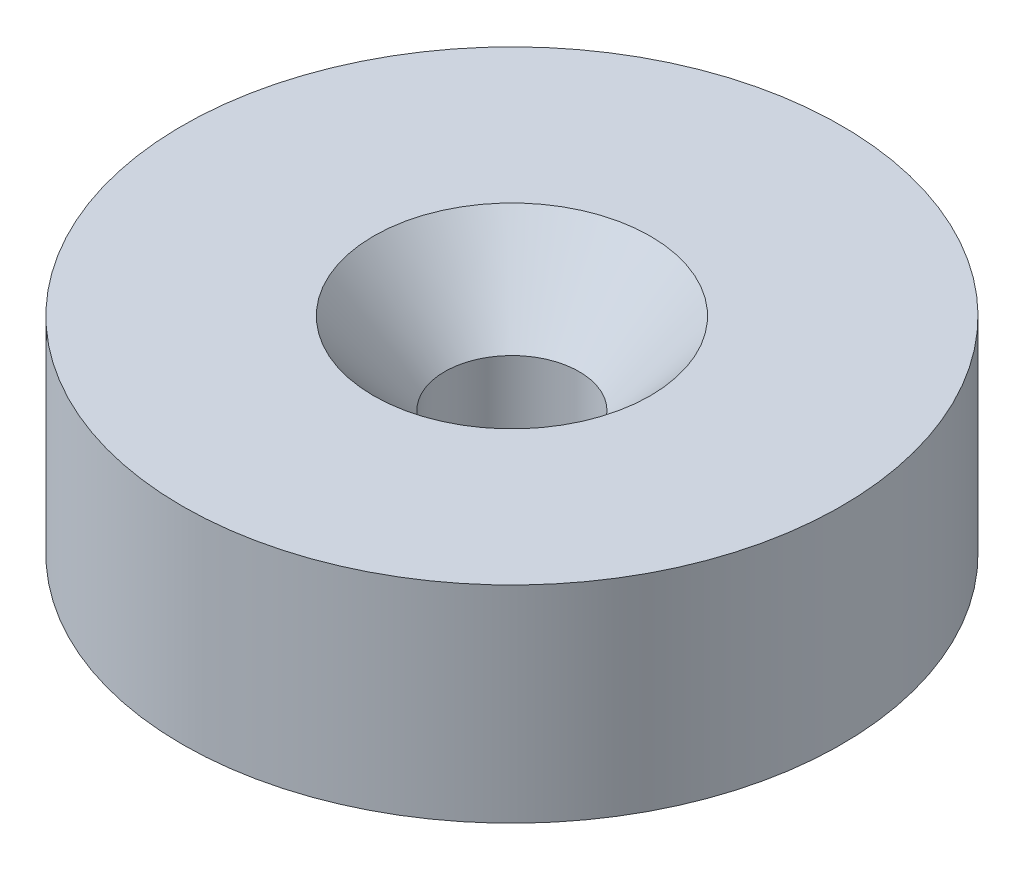
ISO-10303-21;
HEADER;
FILE_DESCRIPTION(('STEP AP214'),'2;1');
FILE_NAME('part.step','',(''),(''),'','','');
FILE_SCHEMA(('AUTOMOTIVE_DESIGN { 1 0 10303 214 1 1 1 1 }'));
ENDSEC;
DATA;
#1=APPLICATION_CONTEXT('core data for automotive mechanical design processes');
#2=APPLICATION_PROTOCOL_DEFINITION('international standard','automotive_design',2000,#1);
#3=PRODUCT_CONTEXT('',#1,'mechanical');
#4=PRODUCT('Part','Part','',(#3));
#5=PRODUCT_RELATED_PRODUCT_CATEGORY('part','',(#4));
#6=PRODUCT_DEFINITION_FORMATION('','',#4);
#7=PRODUCT_DEFINITION_CONTEXT('part definition',#1,'design');
#8=PRODUCT_DEFINITION('design','',#6,#7);
#9=PRODUCT_DEFINITION_SHAPE('','',#8);
#10=(LENGTH_UNIT() NAMED_UNIT(*) SI_UNIT(.MILLI.,.METRE.));
#11=(NAMED_UNIT(*) PLANE_ANGLE_UNIT() SI_UNIT($,.RADIAN.));
#12=(NAMED_UNIT(*) SI_UNIT($,.STERADIAN.) SOLID_ANGLE_UNIT());
#13=UNCERTAINTY_MEASURE_WITH_UNIT(LENGTH_MEASURE(1.E-05),#10,'distance_accuracy_value','');
#14=(GEOMETRIC_REPRESENTATION_CONTEXT(3) GLOBAL_UNCERTAINTY_ASSIGNED_CONTEXT((#13)) GLOBAL_UNIT_ASSIGNED_CONTEXT((#10,
#11,#12)) REPRESENTATION_CONTEXT('',''));
#15=CARTESIAN_POINT('',(0.,0.,0.));
#16=DIRECTION('',(0.,0.,1.));
#17=DIRECTION('',(1.,0.,0.));
#18=AXIS2_PLACEMENT_3D('',#15,#16,#17);
#19=CARTESIAN_POINT('',(0.,7.9502,0.));
#20=DIRECTION('',(0.,-1.,0.));
#21=DIRECTION('',(0.,0.,-1.));
#22=AXIS2_PLACEMENT_3D('',#19,#20,#21);
#23=CYLINDRICAL_SURFACE('',#22,12.7);
#24=CARTESIAN_POINT('',(0.,7.9502,0.));
#25=DIRECTION('',(0.,1.,0.));
#26=DIRECTION('',(0.,0.,1.));
#27=AXIS2_PLACEMENT_3D('',#24,#25,#26);
#28=CIRCLE('',#27,12.7);
#29=CARTESIAN_POINT('',(0.,7.9502,12.7));
#30=VERTEX_POINT('',#29);
#31=EDGE_CURVE('E11',#30,#30,#28,.T.);
#32=ORIENTED_EDGE('',*,*,#31,.F.);
#33=EDGE_LOOP('',(#32));
#34=FACE_BOUND('',#33,.T.);
#35=CARTESIAN_POINT('',(0.,0.,0.));
#36=DIRECTION('',(0.,1.,0.));
#37=DIRECTION('',(0.,0.,1.));
#38=AXIS2_PLACEMENT_3D('',#35,#36,#37);
#39=CIRCLE('',#38,12.7);
#40=CARTESIAN_POINT('',(0.,0.,12.7));
#41=VERTEX_POINT('',#40);
#42=EDGE_CURVE('E49',#41,#41,#39,.T.);
#43=ORIENTED_EDGE('',*,*,#42,.T.);
#44=EDGE_LOOP('',(#43));
#45=FACE_BOUND('',#44,.T.);
#46=ADVANCED_FACE('F43',(#34,#45),#23,.T.);
#47=CARTESIAN_POINT('',(0.,7.9502,0.));
#48=DIRECTION('',(0.,1.,0.));
#49=DIRECTION('',(0.,0.,1.));
#50=AXIS2_PLACEMENT_3D('',#47,#48,#49);
#51=PLANE('',#50);
#52=CARTESIAN_POINT('',(0.,7.9502,0.));
#53=DIRECTION('',(0.,1.,0.));
#54=DIRECTION('',(0.,0.,1.));
#55=AXIS2_PLACEMENT_3D('',#52,#53,#54);
#56=CIRCLE('',#55,5.3310917);
#57=CARTESIAN_POINT('',(0.,7.9502,5.3310917));
#58=VERTEX_POINT('',#57);
#59=EDGE_CURVE('E53',#58,#58,#56,.T.);
#60=ORIENTED_EDGE('',*,*,#59,.F.);
#61=EDGE_LOOP('',(#60));
#62=FACE_BOUND('',#61,.T.);
#63=ORIENTED_EDGE('',*,*,#31,.T.);
#64=EDGE_LOOP('',(#63));
#65=FACE_BOUND('',#64,.T.);
#66=ADVANCED_FACE('F83',(#62,#65),#51,.T.);
#67=CARTESIAN_POINT('',(0.,0.,0.));
#68=DIRECTION('',(0.,1.,0.));
#69=DIRECTION('',(0.,0.,1.));
#70=AXIS2_PLACEMENT_3D('',#67,#68,#69);
#71=PLANE('',#70);
#72=CARTESIAN_POINT('',(0.,0.,0.));
#73=DIRECTION('',(0.,1.,0.));
#74=DIRECTION('',(0.,0.,1.));
#75=AXIS2_PLACEMENT_3D('',#72,#73,#74);
#76=CIRCLE('',#75,2.5908);
#77=CARTESIAN_POINT('',(0.,0.,2.5908));
#78=VERTEX_POINT('',#77);
#79=EDGE_CURVE('E64',#78,#78,#76,.T.);
#80=ORIENTED_EDGE('',*,*,#79,.T.);
#81=EDGE_LOOP('',(#80));
#82=FACE_BOUND('',#81,.T.);
#83=ORIENTED_EDGE('',*,*,#42,.F.);
#84=EDGE_LOOP('',(#83));
#85=FACE_BOUND('',#84,.T.);
#86=ADVANCED_FACE('F68',(#82,#85),#71,.F.);
#87=CARTESIAN_POINT('',(0.,7.9502,0.));
#88=DIRECTION('',(0.,1.,0.));
#89=DIRECTION('',(0.,0.,1.));
#90=AXIS2_PLACEMENT_3D('',#87,#88,#89);
#91=CONICAL_SURFACE('',#90,5.3310917,0.715584993317675);
#92=CARTESIAN_POINT('',(0.,4.79785500175005,0.));
#93=DIRECTION('',(0.,1.,0.));
#94=DIRECTION('',(0.,0.,1.));
#95=AXIS2_PLACEMENT_3D('',#92,#93,#94);
#96=CIRCLE('',#95,2.5908);
#97=CARTESIAN_POINT('',(0.,4.79785500175005,2.5908));
#98=VERTEX_POINT('',#97);
#99=EDGE_CURVE('E58',#98,#98,#96,.T.);
#100=ORIENTED_EDGE('',*,*,#99,.F.);
#101=EDGE_LOOP('',(#100));
#102=FACE_BOUND('',#101,.T.);
#103=ORIENTED_EDGE('',*,*,#59,.T.);
#104=EDGE_LOOP('',(#103));
#105=FACE_BOUND('',#104,.T.);
#106=ADVANCED_FACE('F74',(#102,#105),#91,.F.);
#107=CARTESIAN_POINT('',(0.,7.9502,0.));
#108=DIRECTION('',(0.,1.,0.));
#109=DIRECTION('',(0.,0.,1.));
#110=AXIS2_PLACEMENT_3D('',#107,#108,#109);
#111=CYLINDRICAL_SURFACE('',#110,2.5908);
#112=ORIENTED_EDGE('',*,*,#79,.F.);
#113=EDGE_LOOP('',(#112));
#114=FACE_BOUND('',#113,.T.);
#115=ORIENTED_EDGE('',*,*,#99,.T.);
#116=EDGE_LOOP('',(#115));
#117=FACE_BOUND('',#116,.T.);
#118=ADVANCED_FACE('F71',(#114,#117),#111,.F.);
#119=CLOSED_SHELL('',(#46,#66,#86,#106,#118));
#120=MANIFOLD_SOLID_BREP('B2',#119);
#121=ADVANCED_BREP_SHAPE_REPRESENTATION('',(#18,#120),#14);
#122=SHAPE_DEFINITION_REPRESENTATION(#9,#121);
ENDSEC;
END-ISO-10303-21;
